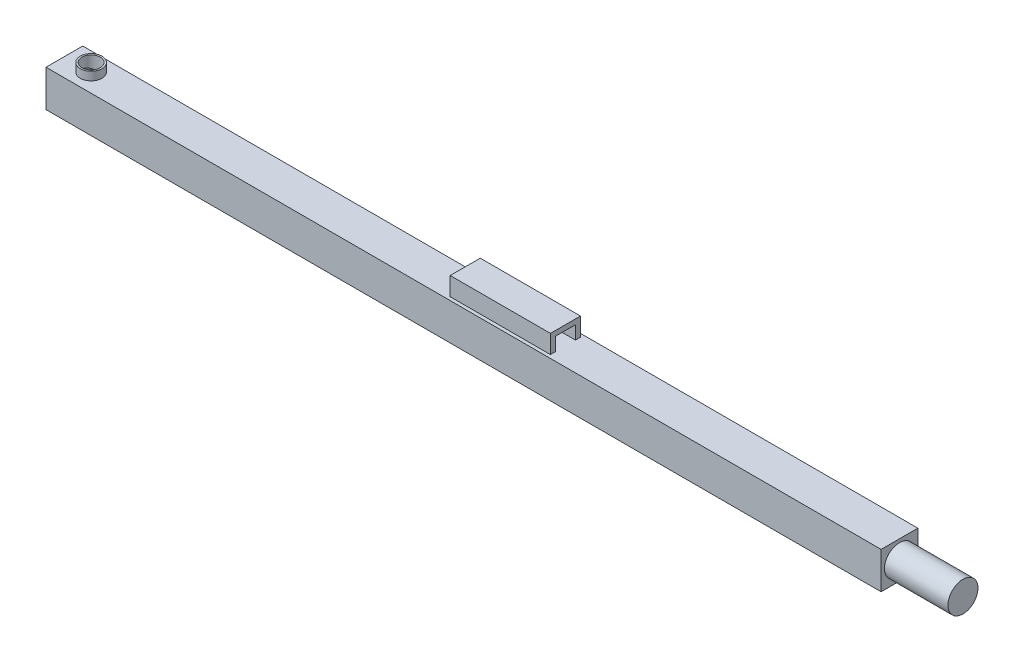
ISO-10303-21;
HEADER;
FILE_DESCRIPTION(('STEP AP214'),'2;1');
FILE_NAME('part.step','',(''),(''),'','','');
FILE_SCHEMA(('AUTOMOTIVE_DESIGN { 1 0 10303 214 1 1 1 1 }'));
ENDSEC;
DATA;
#1=APPLICATION_CONTEXT('core data for automotive mechanical design processes');
#2=APPLICATION_PROTOCOL_DEFINITION('international standard','automotive_design',2000,#1);
#3=PRODUCT_CONTEXT('',#1,'mechanical');
#4=PRODUCT('Part','Part','',(#3));
#5=PRODUCT_RELATED_PRODUCT_CATEGORY('part','',(#4));
#6=PRODUCT_DEFINITION_FORMATION('','',#4);
#7=PRODUCT_DEFINITION_CONTEXT('part definition',#1,'design');
#8=PRODUCT_DEFINITION('design','',#6,#7);
#9=PRODUCT_DEFINITION_SHAPE('','',#8);
#10=(LENGTH_UNIT() NAMED_UNIT(*) SI_UNIT(.MILLI.,.METRE.));
#11=(NAMED_UNIT(*) PLANE_ANGLE_UNIT() SI_UNIT($,.RADIAN.));
#12=(NAMED_UNIT(*) SI_UNIT($,.STERADIAN.) SOLID_ANGLE_UNIT());
#13=UNCERTAINTY_MEASURE_WITH_UNIT(LENGTH_MEASURE(1.E-05),#10,'distance_accuracy_value','');
#14=(GEOMETRIC_REPRESENTATION_CONTEXT(3) GLOBAL_UNCERTAINTY_ASSIGNED_CONTEXT((#13)) GLOBAL_UNIT_ASSIGNED_CONTEXT((#10,
#11,#12)) REPRESENTATION_CONTEXT('',''));
#15=CARTESIAN_POINT('',(0.,0.,0.));
#16=DIRECTION('',(0.,0.,1.));
#17=DIRECTION('',(1.,0.,0.));
#18=AXIS2_PLACEMENT_3D('',#15,#16,#17);
#19=CARTESIAN_POINT('',(-250.,5.5,5.5));
#20=DIRECTION('',(0.,1.,0.));
#21=DIRECTION('',(0.,0.,1.));
#22=AXIS2_PLACEMENT_3D('',#19,#20,#21);
#23=PLANE('',#22);
#24=CARTESIAN_POINT('',(-242.,5.5,0.));
#25=DIRECTION('',(0.,1.,0.));
#26=DIRECTION('',(0.,0.,1.));
#27=AXIS2_PLACEMENT_3D('',#24,#25,#26);
#28=CIRCLE('',#27,3.25000000000001);
#29=CARTESIAN_POINT('',(-242.,5.5,3.25000000000001));
#30=VERTEX_POINT('',#29);
#31=EDGE_CURVE('E382',#30,#30,#28,.T.);
#32=ORIENTED_EDGE('',*,*,#31,.F.);
#33=EDGE_LOOP('',(#32));
#34=FACE_BOUND('',#33,.T.);
#35=DIRECTION('',(0.,0.,1.));
#36=VECTOR('',#35,1.);
#37=CARTESIAN_POINT('',(0.,5.5,5.5));
#38=LINE('',#37,#36);
#39=CARTESIAN_POINT('',(0.,5.5,-5.5));
#40=VERTEX_POINT('',#39);
#41=CARTESIAN_POINT('',(0.,5.5,5.5));
#42=VERTEX_POINT('',#41);
#43=EDGE_CURVE('E254',#40,#42,#38,.T.);
#44=ORIENTED_EDGE('',*,*,#43,.F.);
#45=DIRECTION('',(1.,0.,0.));
#46=VECTOR('',#45,1.);
#47=CARTESIAN_POINT('',(-250.,5.5,-5.5));
#48=LINE('',#47,#46);
#49=CARTESIAN_POINT('',(-250.,5.5,-5.5));
#50=VERTEX_POINT('',#49);
#51=EDGE_CURVE('E250',#50,#40,#48,.T.);
#52=ORIENTED_EDGE('',*,*,#51,.F.);
#53=DIRECTION('',(0.,0.,1.));
#54=VECTOR('',#53,1.);
#55=CARTESIAN_POINT('',(-250.,5.5,5.5));
#56=LINE('',#55,#54);
#57=CARTESIAN_POINT('',(-250.,5.5,5.5));
#58=VERTEX_POINT('',#57);
#59=EDGE_CURVE('E237',#50,#58,#56,.T.);
#60=ORIENTED_EDGE('',*,*,#59,.T.);
#61=DIRECTION('',(1.,0.,0.));
#62=VECTOR('',#61,1.);
#63=CARTESIAN_POINT('',(-250.,5.5,5.5));
#64=LINE('',#63,#62);
#65=EDGE_CURVE('E271',#58,#42,#64,.T.);
#66=ORIENTED_EDGE('',*,*,#65,.T.);
#67=EDGE_LOOP('',(#44,#52,#60,#66));
#68=FACE_BOUND('',#67,.T.);
#69=DIRECTION('',(1.,0.,0.));
#70=VECTOR('',#69,1.);
#71=CARTESIAN_POINT('',(-130.,5.5,-3.));
#72=LINE('',#71,#70);
#73=CARTESIAN_POINT('',(-130.,5.5,-3.));
#74=VERTEX_POINT('',#73);
#75=CARTESIAN_POINT('',(-100.,5.5,-3.));
#76=VERTEX_POINT('',#75);
#77=EDGE_CURVE('E215',#74,#76,#72,.T.);
#78=ORIENTED_EDGE('',*,*,#77,.F.);
#79=DIRECTION('',(0.,0.,-1.));
#80=VECTOR('',#79,1.);
#81=CARTESIAN_POINT('',(-130.,5.5,-3.));
#82=LINE('',#81,#80);
#83=CARTESIAN_POINT('',(-130.,5.5,-4.5));
#84=VERTEX_POINT('',#83);
#85=EDGE_CURVE('E164',#74,#84,#82,.T.);
#86=ORIENTED_EDGE('',*,*,#85,.T.);
#87=DIRECTION('',(1.,0.,0.));
#88=VECTOR('',#87,1.);
#89=CARTESIAN_POINT('',(-130.,5.5,-4.5));
#90=LINE('',#89,#88);
#91=CARTESIAN_POINT('',(-100.,5.5,-4.5));
#92=VERTEX_POINT('',#91);
#93=EDGE_CURVE('E212',#84,#92,#90,.T.);
#94=ORIENTED_EDGE('',*,*,#93,.T.);
#95=DIRECTION('',(0.,0.,-1.));
#96=VECTOR('',#95,1.);
#97=CARTESIAN_POINT('',(-100.,5.5,-3.));
#98=LINE('',#97,#96);
#99=EDGE_CURVE('E193',#76,#92,#98,.T.);
#100=ORIENTED_EDGE('',*,*,#99,.F.);
#101=EDGE_LOOP('',(#78,#86,#94,#100));
#102=FACE_BOUND('',#101,.T.);
#103=DIRECTION('',(1.,0.,0.));
#104=VECTOR('',#103,1.);
#105=CARTESIAN_POINT('',(-130.,5.5,4.5));
#106=LINE('',#105,#104);
#107=CARTESIAN_POINT('',(-130.,5.5,4.5));
#108=VERTEX_POINT('',#107);
#109=CARTESIAN_POINT('',(-100.,5.5,4.5));
#110=VERTEX_POINT('',#109);
#111=EDGE_CURVE('E57',#108,#110,#106,.T.);
#112=ORIENTED_EDGE('',*,*,#111,.F.);
#113=DIRECTION('',(0.,0.,-1.));
#114=VECTOR('',#113,1.);
#115=CARTESIAN_POINT('',(-130.,5.5,4.5));
#116=LINE('',#115,#114);
#117=CARTESIAN_POINT('',(-130.,5.5,3.));
#118=VERTEX_POINT('',#117);
#119=EDGE_CURVE('E61',#108,#118,#116,.T.);
#120=ORIENTED_EDGE('',*,*,#119,.T.);
#121=DIRECTION('',(1.,0.,0.));
#122=VECTOR('',#121,1.);
#123=CARTESIAN_POINT('',(-130.,5.5,3.));
#124=LINE('',#123,#122);
#125=CARTESIAN_POINT('',(-100.,5.5,3.));
#126=VERTEX_POINT('',#125);
#127=EDGE_CURVE('E141',#118,#126,#124,.T.);
#128=ORIENTED_EDGE('',*,*,#127,.T.);
#129=DIRECTION('',(0.,0.,-1.));
#130=VECTOR('',#129,1.);
#131=CARTESIAN_POINT('',(-100.,5.5,4.5));
#132=LINE('',#131,#130);
#133=EDGE_CURVE('E179',#110,#126,#132,.T.);
#134=ORIENTED_EDGE('',*,*,#133,.F.);
#135=EDGE_LOOP('',(#112,#120,#128,#134));
#136=FACE_BOUND('',#135,.T.);
#137=ADVANCED_FACE('F41',(#34,#68,#102,#136),#23,.T.);
#138=CARTESIAN_POINT('',(19.,0.,0.));
#139=DIRECTION('',(-1.,0.,0.));
#140=DIRECTION('',(0.,0.,1.));
#141=AXIS2_PLACEMENT_3D('',#138,#139,#140);
#142=CYLINDRICAL_SURFACE('',#141,4.5);
#143=CARTESIAN_POINT('',(19.,0.,0.));
#144=DIRECTION('',(1.,0.,0.));
#145=DIRECTION('',(0.,0.,-1.));
#146=AXIS2_PLACEMENT_3D('',#143,#144,#145);
#147=CIRCLE('',#146,4.5);
#148=CARTESIAN_POINT('',(19.,0.,-4.5));
#149=VERTEX_POINT('',#148);
#150=EDGE_CURVE('E11',#149,#149,#147,.T.);
#151=ORIENTED_EDGE('',*,*,#150,.F.);
#152=EDGE_LOOP('',(#151));
#153=FACE_BOUND('',#152,.T.);
#154=CARTESIAN_POINT('',(0.,0.,0.));
#155=DIRECTION('',(1.,0.,0.));
#156=DIRECTION('',(0.,0.,-1.));
#157=AXIS2_PLACEMENT_3D('',#154,#155,#156);
#158=CIRCLE('',#157,4.5);
#159=CARTESIAN_POINT('',(0.,0.,-4.5));
#160=VERTEX_POINT('',#159);
#161=EDGE_CURVE('E45',#160,#160,#158,.T.);
#162=ORIENTED_EDGE('',*,*,#161,.T.);
#163=EDGE_LOOP('',(#162));
#164=FACE_BOUND('',#163,.T.);
#165=ADVANCED_FACE('F43',(#153,#164),#142,.T.);
#166=CARTESIAN_POINT('',(19.,0.,0.));
#167=DIRECTION('',(1.,0.,0.));
#168=DIRECTION('',(0.,0.,-1.));
#169=AXIS2_PLACEMENT_3D('',#166,#167,#168);
#170=PLANE('',#169);
#171=ORIENTED_EDGE('',*,*,#150,.T.);
#172=EDGE_LOOP('',(#171));
#173=FACE_BOUND('',#172,.T.);
#174=ADVANCED_FACE('F312',(#173),#170,.T.);
#175=CARTESIAN_POINT('',(-250.,5.5,-5.5));
#176=DIRECTION('',(0.,0.,-1.));
#177=DIRECTION('',(0.,1.,0.));
#178=AXIS2_PLACEMENT_3D('',#175,#176,#177);
#179=PLANE('',#178);
#180=DIRECTION('',(0.,1.,0.));
#181=VECTOR('',#180,1.);
#182=CARTESIAN_POINT('',(0.,5.5,-5.5));
#183=LINE('',#182,#181);
#184=CARTESIAN_POINT('',(0.,-5.5,-5.5));
#185=VERTEX_POINT('',#184);
#186=EDGE_CURVE('E229',#185,#40,#183,.T.);
#187=ORIENTED_EDGE('',*,*,#186,.F.);
#188=DIRECTION('',(1.,0.,0.));
#189=VECTOR('',#188,1.);
#190=CARTESIAN_POINT('',(-250.,-5.5,-5.5));
#191=LINE('',#190,#189);
#192=CARTESIAN_POINT('',(-250.,-5.5,-5.5));
#193=VERTEX_POINT('',#192);
#194=EDGE_CURVE('E265',#193,#185,#191,.T.);
#195=ORIENTED_EDGE('',*,*,#194,.F.);
#196=DIRECTION('',(0.,1.,0.));
#197=VECTOR('',#196,1.);
#198=CARTESIAN_POINT('',(-250.,5.5,-5.5));
#199=LINE('',#198,#197);
#200=EDGE_CURVE('E233',#193,#50,#199,.T.);
#201=ORIENTED_EDGE('',*,*,#200,.T.);
#202=ORIENTED_EDGE('',*,*,#51,.T.);
#203=EDGE_LOOP('',(#187,#195,#201,#202));
#204=FACE_BOUND('',#203,.T.);
#205=ADVANCED_FACE('F278',(#204),#179,.T.);
#206=CARTESIAN_POINT('',(-250.,-5.5,5.5));
#207=DIRECTION('',(0.,-1.,0.));
#208=DIRECTION('',(0.,0.,-1.));
#209=AXIS2_PLACEMENT_3D('',#206,#207,#208);
#210=PLANE('',#209);
#211=DIRECTION('',(0.,0.,-1.));
#212=VECTOR('',#211,1.);
#213=CARTESIAN_POINT('',(0.,-5.5,5.5));
#214=LINE('',#213,#212);
#215=CARTESIAN_POINT('',(0.,-5.5,5.5));
#216=VERTEX_POINT('',#215);
#217=EDGE_CURVE('E238',#216,#185,#214,.T.);
#218=ORIENTED_EDGE('',*,*,#217,.F.);
#219=DIRECTION('',(1.,0.,0.));
#220=VECTOR('',#219,1.);
#221=CARTESIAN_POINT('',(-250.,-5.5,5.5));
#222=LINE('',#221,#220);
#223=CARTESIAN_POINT('',(-250.,-5.5,5.5));
#224=VERTEX_POINT('',#223);
#225=EDGE_CURVE('E268',#224,#216,#222,.T.);
#226=ORIENTED_EDGE('',*,*,#225,.F.);
#227=DIRECTION('',(0.,0.,-1.));
#228=VECTOR('',#227,1.);
#229=CARTESIAN_POINT('',(-250.,-5.5,5.5));
#230=LINE('',#229,#228);
#231=EDGE_CURVE('E246',#224,#193,#230,.T.);
#232=ORIENTED_EDGE('',*,*,#231,.T.);
#233=ORIENTED_EDGE('',*,*,#194,.T.);
#234=EDGE_LOOP('',(#218,#226,#232,#233));
#235=FACE_BOUND('',#234,.T.);
#236=ADVANCED_FACE('F288',(#235),#210,.T.);
#237=CARTESIAN_POINT('',(-250.,5.5,5.5));
#238=DIRECTION('',(0.,0.,1.));
#239=DIRECTION('',(0.,-1.,0.));
#240=AXIS2_PLACEMENT_3D('',#237,#238,#239);
#241=PLANE('',#240);
#242=DIRECTION('',(0.,-1.,0.));
#243=VECTOR('',#242,1.);
#244=CARTESIAN_POINT('',(0.,5.5,5.5));
#245=LINE('',#244,#243);
#246=EDGE_CURVE('E258',#42,#216,#245,.T.);
#247=ORIENTED_EDGE('',*,*,#246,.F.);
#248=ORIENTED_EDGE('',*,*,#65,.F.);
#249=DIRECTION('',(0.,-1.,0.));
#250=VECTOR('',#249,1.);
#251=CARTESIAN_POINT('',(-250.,5.5,5.5));
#252=LINE('',#251,#250);
#253=EDGE_CURVE('E242',#58,#224,#252,.T.);
#254=ORIENTED_EDGE('',*,*,#253,.T.);
#255=ORIENTED_EDGE('',*,*,#225,.T.);
#256=EDGE_LOOP('',(#247,#248,#254,#255));
#257=FACE_BOUND('',#256,.T.);
#258=ADVANCED_FACE('F294',(#257),#241,.T.);
#259=CARTESIAN_POINT('',(-250.,0.,0.));
#260=DIRECTION('',(1.,0.,0.));
#261=DIRECTION('',(0.,0.,-1.));
#262=AXIS2_PLACEMENT_3D('',#259,#260,#261);
#263=PLANE('',#262);
#264=CARTESIAN_POINT('',(-250.,0.,0.));
#265=DIRECTION('',(-1.,0.,0.));
#266=DIRECTION('',(0.,0.,1.));
#267=AXIS2_PLACEMENT_3D('',#264,#265,#266);
#268=CIRCLE('',#267,4.85);
#269=CARTESIAN_POINT('',(-250.,0.,4.85));
#270=VERTEX_POINT('',#269);
#271=EDGE_CURVE('E208',#270,#270,#268,.T.);
#272=ORIENTED_EDGE('',*,*,#271,.F.);
#273=EDGE_LOOP('',(#272));
#274=FACE_BOUND('',#273,.T.);
#275=ORIENTED_EDGE('',*,*,#200,.F.);
#276=ORIENTED_EDGE('',*,*,#231,.F.);
#277=ORIENTED_EDGE('',*,*,#253,.F.);
#278=ORIENTED_EDGE('',*,*,#59,.F.);
#279=EDGE_LOOP('',(#275,#276,#277,#278));
#280=FACE_BOUND('',#279,.T.);
#281=ADVANCED_FACE('F291',(#274,#280),#263,.F.);
#282=CARTESIAN_POINT('',(0.,0.,0.));
#283=DIRECTION('',(1.,0.,0.));
#284=DIRECTION('',(0.,0.,-1.));
#285=AXIS2_PLACEMENT_3D('',#282,#283,#284);
#286=PLANE('',#285);
#287=ORIENTED_EDGE('',*,*,#161,.F.);
#288=EDGE_LOOP('',(#287));
#289=FACE_BOUND('',#288,.T.);
#290=ORIENTED_EDGE('',*,*,#186,.T.);
#291=ORIENTED_EDGE('',*,*,#43,.T.);
#292=ORIENTED_EDGE('',*,*,#246,.T.);
#293=ORIENTED_EDGE('',*,*,#217,.T.);
#294=EDGE_LOOP('',(#290,#291,#292,#293));
#295=FACE_BOUND('',#294,.T.);
#296=ADVANCED_FACE('F285',(#289,#295),#286,.T.);
#297=CARTESIAN_POINT('',(-230.5,0.,0.));
#298=DIRECTION('',(-1.,0.,0.));
#299=DIRECTION('',(0.,0.,1.));
#300=AXIS2_PLACEMENT_3D('',#297,#298,#299);
#301=CYLINDRICAL_SURFACE('',#300,4.85);
#302=CARTESIAN_POINT('',(-242.,3.99499687108763,2.75000000000001));
#303=CARTESIAN_POINT('',(-242.140148129044,3.99500278386631,2.74999611179178));
#304=CARTESIAN_POINT('',(-242.280324743093,4.00248311622767,2.73921919092268));
#305=CARTESIAN_POINT('',(-242.55608468677,4.03116988545612,2.69681055201822));
#306=CARTESIAN_POINT('',(-242.69166285366,4.05239124554039,2.66515615965277));
#307=CARTESIAN_POINT('',(-242.953716281808,4.10525991664131,2.58296045312672));
#308=CARTESIAN_POINT('',(-243.080243684821,4.13684044935804,2.53253983838406));
#309=CARTESIAN_POINT('',(-243.322996365681,4.20675366354531,2.41462473063285));
#310=CARTESIAN_POINT('',(-243.439218353346,4.24508848985636,2.34712481107608));
#311=CARTESIAN_POINT('',(-243.671839838358,4.32920780963132,2.18845946376495));
#312=CARTESIAN_POINT('',(-243.786904539105,4.37534978442236,2.09552608048314));
#313=CARTESIAN_POINT('',(-244.000897884011,4.46701682285616,1.89227441835656));
#314=CARTESIAN_POINT('',(-244.099816250377,4.51254147677701,1.78194515348325));
#315=CARTESIAN_POINT('',(-244.287776733739,4.60288049861903,1.53456119313666));
#316=CARTESIAN_POINT('',(-244.375046208878,4.64723551975249,1.39597557668844));
#317=CARTESIAN_POINT('',(-244.524406238357,4.72531132170893,1.1030974150113));
#318=CARTESIAN_POINT('',(-244.586517268411,4.75904074540173,0.948817771166128));
#319=CARTESIAN_POINT('',(-244.678057631585,4.80943539171457,0.643182108171853));
#320=CARTESIAN_POINT('',(-244.709867342526,4.82733358071455,0.492747361508253));
#321=CARTESIAN_POINT('',(-244.747877352965,4.84876982874395,0.187710513294175));
#322=CARTESIAN_POINT('',(-244.754098493511,4.852319574068,0.0331119064215414));
#323=CARTESIAN_POINT('',(-244.741352839552,4.84510173315244,-0.257383530114916));
#324=CARTESIAN_POINT('',(-244.725107649154,4.83588099479412,-0.39344987536845));
#325=CARTESIAN_POINT('',(-244.672956715029,4.80668603273937,-0.660543066060498));
#326=CARTESIAN_POINT('',(-244.637049526735,4.7867110189283,-0.791569540462688));
#327=CARTESIAN_POINT('',(-244.546696986482,4.73753319674117,-1.04657462066225));
#328=CARTESIAN_POINT('',(-244.492082341739,4.70824630074877,-1.17047635226557));
#329=CARTESIAN_POINT('',(-244.366278771084,4.64288586098418,-1.40757083670719));
#330=CARTESIAN_POINT('',(-244.29508487318,4.6068102819613,-1.52076036268644));
#331=CARTESIAN_POINT('',(-244.129093672802,4.52627760954665,-1.74678706409307));
#332=CARTESIAN_POINT('',(-244.032545888848,4.4813343203207,-1.85816507314648));
#333=CARTESIAN_POINT('',(-243.823139694538,4.39032343429931,-2.06403950381402));
#334=CARTESIAN_POINT('',(-243.710261916056,4.34425455720064,-2.15851557709926));
#335=CARTESIAN_POINT('',(-243.458274846502,4.2510642088863,-2.33710232040582));
#336=CARTESIAN_POINT('',(-243.317682304011,4.20427567613752,-2.41931288118586));
#337=CARTESIAN_POINT('',(-243.021695696721,4.12114856941814,-2.55836839918138));
#338=CARTESIAN_POINT('',(-242.8663282065,4.08479168901723,-2.61525789011169));
#339=CARTESIAN_POINT('',(-242.581381644945,4.03522025378872,-2.69092129033682));
#340=CARTESIAN_POINT('',(-242.453902133165,4.01863367802851,-2.71540145139332));
#341=CARTESIAN_POINT('',(-242.195813919476,3.99773275808194,-2.7460881914568));
#342=CARTESIAN_POINT('',(-242.065208242027,3.99340700030988,-2.75231176569472));
#343=CARTESIAN_POINT('',(-241.804601667544,3.99764733828625,-2.74614715951335));
#344=CARTESIAN_POINT('',(-241.674601096947,4.006219729836,-2.73374988995546));
#345=CARTESIAN_POINT('',(-241.41889243193,4.03503352552628,-2.69103084776328));
#346=CARTESIAN_POINT('',(-241.293187488663,4.05528330915914,-2.66069620318489));
#347=CARTESIAN_POINT('',(-241.047196277784,4.10525111265719,-2.58293591290846));
#348=CARTESIAN_POINT('',(-240.927013434102,4.13510061558872,-2.53527165259626));
#349=CARTESIAN_POINT('',(-240.695862236329,4.20100879289466,-2.42449446476014));
#350=CARTESIAN_POINT('',(-240.584897708351,4.23707002658521,-2.36137516501758));
#351=CARTESIAN_POINT('',(-240.356097508543,4.31846874930629,-2.20950242533829));
#352=CARTESIAN_POINT('',(-240.240117217685,4.36435783587399,-2.11824301990886));
#353=CARTESIAN_POINT('',(-240.024052082195,4.4558706780505,-1.9182863071315));
#354=CARTESIAN_POINT('',(-239.923980163931,4.50149418916209,-1.80957496187595));
#355=CARTESIAN_POINT('',(-239.733071759397,4.592522450961,-1.56518403218679));
#356=CARTESIAN_POINT('',(-239.644033722279,4.63748901945548,-1.42791962962877));
#357=CARTESIAN_POINT('',(-239.490876361747,4.71714084498123,-1.13740689999307));
#358=CARTESIAN_POINT('',(-239.426737051612,4.75183434308875,-0.984171519020548));
#359=CARTESIAN_POINT('',(-239.330841747666,4.80447076507215,-0.679321450604231));
#360=CARTESIAN_POINT('',(-239.296854821989,4.82355738289874,-0.528611524685241));
#361=CARTESIAN_POINT('',(-239.254681484852,4.84731417290013,-0.222549891418339));
#362=CARTESIAN_POINT('',(-239.246473145691,4.85199659745485,-0.0672022426239809));
#363=CARTESIAN_POINT('',(-239.255754246456,4.84674034437472,0.224672729407955));
#364=CARTESIAN_POINT('',(-239.270426038648,4.83840464822277,0.361330303010201));
#365=CARTESIAN_POINT('',(-239.319625896219,4.8108200910004,0.629861874563809));
#366=CARTESIAN_POINT('',(-239.354155099896,4.79157060431255,0.761735597826667));
#367=CARTESIAN_POINT('',(-239.441734234926,4.74377248534254,1.01793645630676));
#368=CARTESIAN_POINT('',(-239.494858328294,4.71518664789308,1.14223099725257));
#369=CARTESIAN_POINT('',(-239.617736418236,4.65106821279692,1.3803212615867));
#370=CARTESIAN_POINT('',(-239.687495116795,4.61553365151597,1.49411400386948));
#371=CARTESIAN_POINT('',(-239.850337543623,4.53601707561001,1.72136030641884));
#372=CARTESIAN_POINT('',(-239.945140902497,4.49153597251034,1.83340613825954));
#373=CARTESIAN_POINT('',(-240.151045787117,4.40114407122408,2.04089918005069));
#374=CARTESIAN_POINT('',(-240.262166742717,4.35523162075062,2.13632630131285));
#375=CARTESIAN_POINT('',(-240.510915679527,4.26177892807099,2.31757343556412));
#376=CARTESIAN_POINT('',(-240.650087346303,4.21454267106831,2.40144953025341));
#377=CARTESIAN_POINT('',(-240.943423465417,4.12998785398435,2.5441353835176));
#378=CARTESIAN_POINT('',(-241.097560774423,4.09265178048293,2.6029895187624));
#379=CARTESIAN_POINT('',(-241.376712352354,4.04161546646841,2.6813150103508));
#380=CARTESIAN_POINT('',(-241.499347689482,4.02433708271593,2.70695907275095));
#381=CARTESIAN_POINT('',(-241.747982867213,4.00102965212983,2.74129649651876));
#382=CARTESIAN_POINT('',(-241.873979917883,3.99499155436411,2.7500034962459));
#383=CARTESIAN_POINT('',(-242.,3.99499687108763,2.75000000000001));
#384=B_SPLINE_CURVE_WITH_KNOTS('',3,(#302,#303,#304,#305,#306,#307,#308,#309,#310,#311,#312,
#313,#314,#315,#316,#317,#318,#319,#320,#321,#322,#323,#324,#325,#326,#327,#328,#329,#330,#331,
#332,#333,#334,#335,#336,#337,#338,#339,#340,#341,#342,#343,#344,#345,#346,#347,#348,#349,#350,
#351,#352,#353,#354,#355,#356,#357,#358,#359,#360,#361,#362,#363,#364,#365,#366,#367,#368,#369,
#370,#371,#372,#373,#374,#375,#376,#377,#378,#379,#380,#381,#382,#383),.UNSPECIFIED.,.T.,.F.,(4,
2,2,2,2,2,2,2,2,2,2,2,2,2,2,2,2,2,2,2,2,2,2,2,2,2,2,2,2,2,2,2,2,2,2,2,2,2,2,2,4),(0.,
0.419917847492399,0.840292506497292,1.25800887807364,1.67585813624488,2.13880751982352,
2.6020504497713,3.10835212505615,3.61424090438706,4.07595095429728,4.5372848820067,
4.94736435129946,5.35747395316785,5.77139742456761,6.18544518871243,6.64586394596752,
7.10683332736472,7.61260888802846,8.11749136092445,8.50835915741832,8.8988629756994,
9.28955746723909,9.68053266379584,10.0771088418562,10.4738488071429,10.9356238386338,
11.3977721890026,11.9041173724499,12.4100552575175,12.8743493760863,13.3382484511401,
13.7493647259448,14.1605045697846,14.5733032064221,14.9862186645089,15.4444493515496,
15.9032301598036,16.4083501852377,16.9125706005338,17.290461805001,17.6680485910968),.UNSPECIFIED.);
#385=CARTESIAN_POINT('',(-242.,3.99499687108763,2.75000000000001));
#386=VERTEX_POINT('',#385);
#387=EDGE_CURVE('E180',#386,#386,#384,.T.);
#388=ORIENTED_EDGE('',*,*,#387,.F.);
#389=EDGE_LOOP('',(#388));
#390=FACE_BOUND('',#389,.T.);
#391=CARTESIAN_POINT('',(-230.5,0.,0.));
#392=DIRECTION('',(-1.,0.,0.));
#393=DIRECTION('',(0.,0.,1.));
#394=AXIS2_PLACEMENT_3D('',#391,#392,#393);
#395=CIRCLE('',#394,4.85);
#396=CARTESIAN_POINT('',(-230.5,0.,4.85));
#397=VERTEX_POINT('',#396);
#398=EDGE_CURVE('E225',#397,#397,#395,.T.);
#399=ORIENTED_EDGE('',*,*,#398,.F.);
#400=EDGE_LOOP('',(#399));
#401=FACE_BOUND('',#400,.T.);
#402=ORIENTED_EDGE('',*,*,#271,.T.);
#403=EDGE_LOOP('',(#402));
#404=FACE_BOUND('',#403,.T.);
#405=ADVANCED_FACE('F328',(#390,#401,#404),#301,.F.);
#406=CARTESIAN_POINT('',(-230.5,0.,0.));
#407=DIRECTION('',(-1.,0.,0.));
#408=DIRECTION('',(0.,0.,1.));
#409=AXIS2_PLACEMENT_3D('',#406,#407,#408);
#410=PLANE('',#409);
#411=ORIENTED_EDGE('',*,*,#398,.T.);
#412=EDGE_LOOP('',(#411));
#413=FACE_BOUND('',#412,.T.);
#414=ADVANCED_FACE('F333',(#413),#410,.T.);
#415=CARTESIAN_POINT('',(-130.,11.,4.5));
#416=DIRECTION('',(0.,0.,1.));
#417=DIRECTION('',(0.,-1.,0.));
#418=AXIS2_PLACEMENT_3D('',#415,#416,#417);
#419=PLANE('',#418);
#420=DIRECTION('',(0.,-1.,0.));
#421=VECTOR('',#420,1.);
#422=CARTESIAN_POINT('',(-100.,11.,4.5));
#423=LINE('',#422,#421);
#424=CARTESIAN_POINT('',(-100.,11.,4.5));
#425=VERTEX_POINT('',#424);
#426=EDGE_CURVE('E175',#425,#110,#423,.T.);
#427=ORIENTED_EDGE('',*,*,#426,.F.);
#428=DIRECTION('',(1.,0.,0.));
#429=VECTOR('',#428,1.);
#430=CARTESIAN_POINT('',(-130.,11.,4.5));
#431=LINE('',#430,#429);
#432=CARTESIAN_POINT('',(-130.,11.,4.5));
#433=VERTEX_POINT('',#432);
#434=EDGE_CURVE('E205',#433,#425,#431,.T.);
#435=ORIENTED_EDGE('',*,*,#434,.F.);
#436=DIRECTION('',(0.,-1.,0.));
#437=VECTOR('',#436,1.);
#438=CARTESIAN_POINT('',(-130.,11.,4.5));
#439=LINE('',#438,#437);
#440=EDGE_CURVE('E158',#433,#108,#439,.T.);
#441=ORIENTED_EDGE('',*,*,#440,.T.);
#442=ORIENTED_EDGE('',*,*,#111,.T.);
#443=EDGE_LOOP('',(#427,#435,#441,#442));
#444=FACE_BOUND('',#443,.T.);
#445=ADVANCED_FACE('F339',(#444),#419,.T.);
#446=CARTESIAN_POINT('',(-130.,11.,4.5));
#447=DIRECTION('',(0.,1.,0.));
#448=DIRECTION('',(0.,0.,1.));
#449=AXIS2_PLACEMENT_3D('',#446,#447,#448);
#450=PLANE('',#449);
#451=DIRECTION('',(0.,0.,1.));
#452=VECTOR('',#451,1.);
#453=CARTESIAN_POINT('',(-100.,11.,4.5));
#454=LINE('',#453,#452);
#455=CARTESIAN_POINT('',(-100.,11.,-4.5));
#456=VERTEX_POINT('',#455);
#457=EDGE_CURVE('E201',#456,#425,#454,.T.);
#458=ORIENTED_EDGE('',*,*,#457,.F.);
#459=DIRECTION('',(1.,0.,0.));
#460=VECTOR('',#459,1.);
#461=CARTESIAN_POINT('',(-130.,11.,-4.5));
#462=LINE('',#461,#460);
#463=CARTESIAN_POINT('',(-130.,11.,-4.5));
#464=VERTEX_POINT('',#463);
#465=EDGE_CURVE('E209',#464,#456,#462,.T.);
#466=ORIENTED_EDGE('',*,*,#465,.F.);
#467=DIRECTION('',(0.,0.,1.));
#468=VECTOR('',#467,1.);
#469=CARTESIAN_POINT('',(-130.,11.,4.5));
#470=LINE('',#469,#468);
#471=EDGE_CURVE('E171',#464,#433,#470,.T.);
#472=ORIENTED_EDGE('',*,*,#471,.T.);
#473=ORIENTED_EDGE('',*,*,#434,.T.);
#474=EDGE_LOOP('',(#458,#466,#472,#473));
#475=FACE_BOUND('',#474,.T.);
#476=ADVANCED_FACE('F343',(#475),#450,.T.);
#477=CARTESIAN_POINT('',(-130.,11.,-4.5));
#478=DIRECTION('',(0.,0.,-1.));
#479=DIRECTION('',(-1.,0.,0.));
#480=AXIS2_PLACEMENT_3D('',#477,#478,#479);
#481=PLANE('',#480);
#482=DIRECTION('',(0.,1.,0.));
#483=VECTOR('',#482,1.);
#484=CARTESIAN_POINT('',(-100.,11.,-4.5));
#485=LINE('',#484,#483);
#486=EDGE_CURVE('E197',#92,#456,#485,.T.);
#487=ORIENTED_EDGE('',*,*,#486,.F.);
#488=ORIENTED_EDGE('',*,*,#93,.F.);
#489=DIRECTION('',(0.,1.,0.));
#490=VECTOR('',#489,1.);
#491=CARTESIAN_POINT('',(-130.,11.,-4.5));
#492=LINE('',#491,#490);
#493=EDGE_CURVE('E167',#84,#464,#492,.T.);
#494=ORIENTED_EDGE('',*,*,#493,.T.);
#495=ORIENTED_EDGE('',*,*,#465,.T.);
#496=EDGE_LOOP('',(#487,#488,#494,#495));
#497=FACE_BOUND('',#496,.T.);
#498=ADVANCED_FACE('F352',(#497),#481,.T.);
#499=CARTESIAN_POINT('',(-130.,9.5,-3.));
#500=DIRECTION('',(0.,0.,1.));
#501=DIRECTION('',(1.,0.,0.));
#502=AXIS2_PLACEMENT_3D('',#499,#500,#501);
#503=PLANE('',#502);
#504=DIRECTION('',(0.,-1.,0.));
#505=VECTOR('',#504,1.);
#506=CARTESIAN_POINT('',(-100.,9.5,-3.));
#507=LINE('',#506,#505);
#508=CARTESIAN_POINT('',(-100.,9.5,-3.));
#509=VERTEX_POINT('',#508);
#510=EDGE_CURVE('E189',#509,#76,#507,.T.);
#511=ORIENTED_EDGE('',*,*,#510,.F.);
#512=DIRECTION('',(1.,0.,0.));
#513=VECTOR('',#512,1.);
#514=CARTESIAN_POINT('',(-130.,9.5,-3.));
#515=LINE('',#514,#513);
#516=CARTESIAN_POINT('',(-130.,9.5,-3.));
#517=VERTEX_POINT('',#516);
#518=EDGE_CURVE('E140',#517,#509,#515,.T.);
#519=ORIENTED_EDGE('',*,*,#518,.F.);
#520=DIRECTION('',(0.,-1.,0.));
#521=VECTOR('',#520,1.);
#522=CARTESIAN_POINT('',(-130.,9.5,-3.));
#523=LINE('',#522,#521);
#524=EDGE_CURVE('E151',#517,#74,#523,.T.);
#525=ORIENTED_EDGE('',*,*,#524,.T.);
#526=ORIENTED_EDGE('',*,*,#77,.T.);
#527=EDGE_LOOP('',(#511,#519,#525,#526));
#528=FACE_BOUND('',#527,.T.);
#529=ADVANCED_FACE('F349',(#528),#503,.T.);
#530=CARTESIAN_POINT('',(-130.,9.5,3.));
#531=DIRECTION('',(0.,-1.,0.));
#532=DIRECTION('',(0.,0.,-1.));
#533=AXIS2_PLACEMENT_3D('',#530,#531,#532);
#534=PLANE('',#533);
#535=DIRECTION('',(0.,0.,-1.));
#536=VECTOR('',#535,1.);
#537=CARTESIAN_POINT('',(-100.,9.5,3.));
#538=LINE('',#537,#536);
#539=CARTESIAN_POINT('',(-100.,9.5,3.));
#540=VERTEX_POINT('',#539);
#541=EDGE_CURVE('E134',#540,#509,#538,.T.);
#542=ORIENTED_EDGE('',*,*,#541,.F.);
#543=DIRECTION('',(1.,0.,0.));
#544=VECTOR('',#543,1.);
#545=CARTESIAN_POINT('',(-130.,9.5,3.));
#546=LINE('',#545,#544);
#547=CARTESIAN_POINT('',(-130.,9.5,3.));
#548=VERTEX_POINT('',#547);
#549=EDGE_CURVE('E129',#548,#540,#546,.T.);
#550=ORIENTED_EDGE('',*,*,#549,.F.);
#551=DIRECTION('',(0.,0.,-1.));
#552=VECTOR('',#551,1.);
#553=CARTESIAN_POINT('',(-130.,9.5,3.));
#554=LINE('',#553,#552);
#555=EDGE_CURVE('E132',#548,#517,#554,.T.);
#556=ORIENTED_EDGE('',*,*,#555,.T.);
#557=ORIENTED_EDGE('',*,*,#518,.T.);
#558=EDGE_LOOP('',(#542,#550,#556,#557));
#559=FACE_BOUND('',#558,.T.);
#560=ADVANCED_FACE('F131',(#559),#534,.T.);
#561=CARTESIAN_POINT('',(-130.,9.5,3.));
#562=DIRECTION('',(0.,0.,-1.));
#563=DIRECTION('',(0.,1.,0.));
#564=AXIS2_PLACEMENT_3D('',#561,#562,#563);
#565=PLANE('',#564);
#566=DIRECTION('',(0.,1.,0.));
#567=VECTOR('',#566,1.);
#568=CARTESIAN_POINT('',(-100.,9.5,3.));
#569=LINE('',#568,#567);
#570=EDGE_CURVE('E184',#126,#540,#569,.T.);
#571=ORIENTED_EDGE('',*,*,#570,.F.);
#572=ORIENTED_EDGE('',*,*,#127,.F.);
#573=DIRECTION('',(0.,1.,0.));
#574=VECTOR('',#573,1.);
#575=CARTESIAN_POINT('',(-130.,9.5,3.));
#576=LINE('',#575,#574);
#577=EDGE_CURVE('E148',#118,#548,#576,.T.);
#578=ORIENTED_EDGE('',*,*,#577,.T.);
#579=ORIENTED_EDGE('',*,*,#549,.T.);
#580=EDGE_LOOP('',(#571,#572,#578,#579));
#581=FACE_BOUND('',#580,.T.);
#582=ADVANCED_FACE('F154',(#581),#565,.T.);
#583=CARTESIAN_POINT('',(-130.,0.,0.));
#584=DIRECTION('',(1.,0.,0.));
#585=DIRECTION('',(0.,0.,-1.));
#586=AXIS2_PLACEMENT_3D('',#583,#584,#585);
#587=PLANE('',#586);
#588=ORIENTED_EDGE('',*,*,#440,.F.);
#589=ORIENTED_EDGE('',*,*,#471,.F.);
#590=ORIENTED_EDGE('',*,*,#493,.F.);
#591=ORIENTED_EDGE('',*,*,#85,.F.);
#592=ORIENTED_EDGE('',*,*,#524,.F.);
#593=ORIENTED_EDGE('',*,*,#555,.F.);
#594=ORIENTED_EDGE('',*,*,#577,.F.);
#595=ORIENTED_EDGE('',*,*,#119,.F.);
#596=EDGE_LOOP('',(#588,#589,#590,#591,#592,#593,#594,#595));
#597=FACE_BOUND('',#596,.T.);
#598=ADVANCED_FACE('F147',(#597),#587,.F.);
#599=CARTESIAN_POINT('',(-100.,0.,0.));
#600=DIRECTION('',(1.,0.,0.));
#601=DIRECTION('',(0.,0.,-1.));
#602=AXIS2_PLACEMENT_3D('',#599,#600,#601);
#603=PLANE('',#602);
#604=ORIENTED_EDGE('',*,*,#426,.T.);
#605=ORIENTED_EDGE('',*,*,#133,.T.);
#606=ORIENTED_EDGE('',*,*,#570,.T.);
#607=ORIENTED_EDGE('',*,*,#541,.T.);
#608=ORIENTED_EDGE('',*,*,#510,.T.);
#609=ORIENTED_EDGE('',*,*,#99,.T.);
#610=ORIENTED_EDGE('',*,*,#486,.T.);
#611=ORIENTED_EDGE('',*,*,#457,.T.);
#612=EDGE_LOOP('',(#604,#605,#606,#607,#608,#609,#610,#611));
#613=FACE_BOUND('',#612,.T.);
#614=ADVANCED_FACE('F360',(#613),#603,.T.);
#615=CARTESIAN_POINT('',(-242.,-5.501,0.));
#616=DIRECTION('',(0.,1.,0.));
#617=DIRECTION('',(0.,0.,1.));
#618=AXIS2_PLACEMENT_3D('',#615,#616,#617);
#619=CYLINDRICAL_SURFACE('',#618,2.75000000000001);
#620=ORIENTED_EDGE('',*,*,#387,.T.);
#621=EDGE_LOOP('',(#620));
#622=FACE_BOUND('',#621,.T.);
#623=CARTESIAN_POINT('',(-242.,8.,0.));
#624=DIRECTION('',(0.,1.,0.));
#625=DIRECTION('',(0.,0.,1.));
#626=AXIS2_PLACEMENT_3D('',#623,#624,#625);
#627=CIRCLE('',#626,2.75000000000001);
#628=CARTESIAN_POINT('',(-242.,8.,2.75000000000001));
#629=VERTEX_POINT('',#628);
#630=EDGE_CURVE('E396',#629,#629,#627,.T.);
#631=ORIENTED_EDGE('',*,*,#630,.T.);
#632=EDGE_LOOP('',(#631));
#633=FACE_BOUND('',#632,.T.);
#634=ADVANCED_FACE('F363',(#622,#633),#619,.F.);
#635=CARTESIAN_POINT('',(-242.,8.,0.));
#636=DIRECTION('',(0.,-1.,0.));
#637=DIRECTION('',(0.,0.,-1.));
#638=AXIS2_PLACEMENT_3D('',#635,#636,#637);
#639=CYLINDRICAL_SURFACE('',#638,3.25000000000001);
#640=CARTESIAN_POINT('',(-242.,8.,0.));
#641=DIRECTION('',(0.,1.,0.));
#642=DIRECTION('',(0.,0.,1.));
#643=AXIS2_PLACEMENT_3D('',#640,#641,#642);
#644=CIRCLE('',#643,3.25000000000001);
#645=CARTESIAN_POINT('',(-242.,8.,3.25000000000001));
#646=VERTEX_POINT('',#645);
#647=EDGE_CURVE('E381',#646,#646,#644,.T.);
#648=ORIENTED_EDGE('',*,*,#647,.F.);
#649=EDGE_LOOP('',(#648));
#650=FACE_BOUND('',#649,.T.);
#651=ORIENTED_EDGE('',*,*,#31,.T.);
#652=EDGE_LOOP('',(#651));
#653=FACE_BOUND('',#652,.T.);
#654=ADVANCED_FACE('F370',(#650,#653),#639,.T.);
#655=CARTESIAN_POINT('',(0.,8.,0.));
#656=DIRECTION('',(0.,1.,0.));
#657=DIRECTION('',(0.,0.,1.));
#658=AXIS2_PLACEMENT_3D('',#655,#656,#657);
#659=PLANE('',#658);
#660=ORIENTED_EDGE('',*,*,#630,.F.);
#661=EDGE_LOOP('',(#660));
#662=FACE_BOUND('',#661,.T.);
#663=ORIENTED_EDGE('',*,*,#647,.T.);
#664=EDGE_LOOP('',(#663));
#665=FACE_BOUND('',#664,.T.);
#666=ADVANCED_FACE('F403',(#662,#665),#659,.T.);
#667=CLOSED_SHELL('',(#137,#165,#174,#205,#236,#258,#281,#296,#405,#414,#445,#476,#498,#529,
#560,#582,#598,#614,#634,#654,#666));
#668=MANIFOLD_SOLID_BREP('B2',#667);
#669=ADVANCED_BREP_SHAPE_REPRESENTATION('',(#18,#668),#14);
#670=SHAPE_DEFINITION_REPRESENTATION(#9,#669);
ENDSEC;
END-ISO-10303-21;
